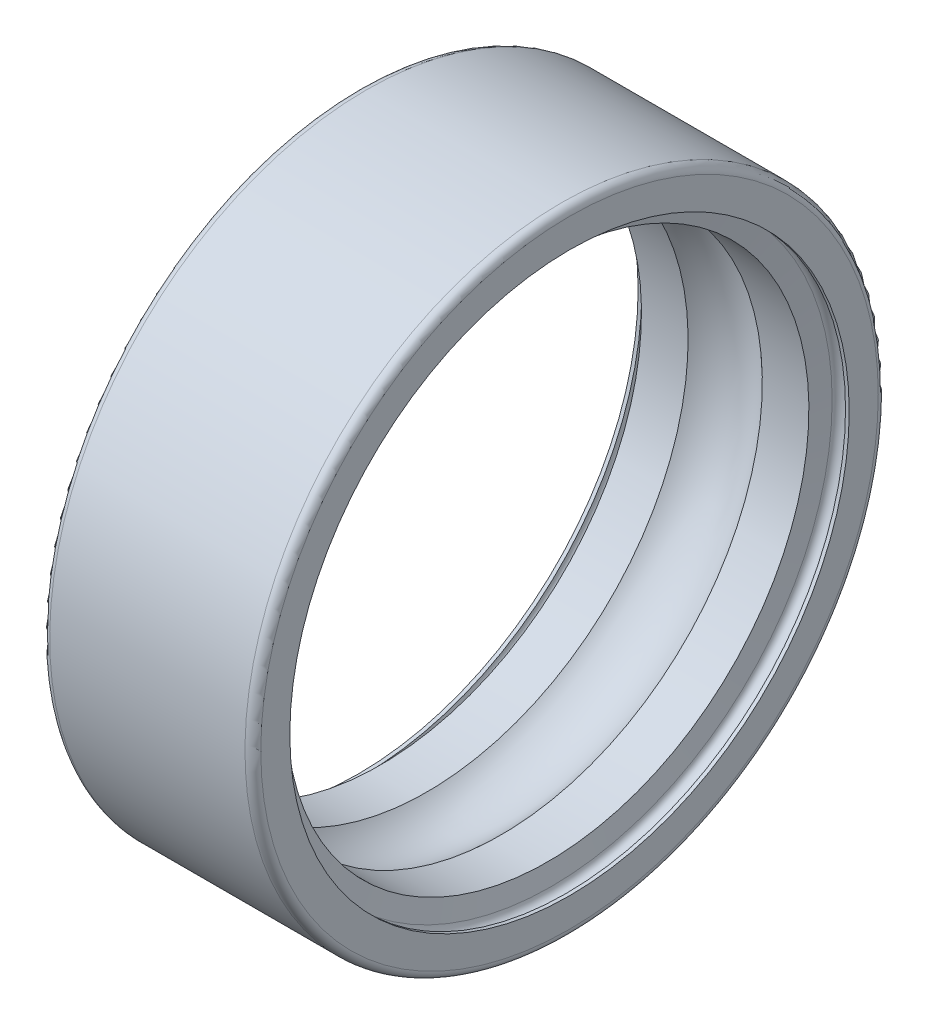
ISO-10303-21;
HEADER;
FILE_DESCRIPTION(('STEP AP214'),'2;1');
FILE_NAME('part.step','',(''),(''),'','','');
FILE_SCHEMA(('AUTOMOTIVE_DESIGN { 1 0 10303 214 1 1 1 1 }'));
ENDSEC;
DATA;
#1=APPLICATION_CONTEXT('core data for automotive mechanical design processes');
#2=APPLICATION_PROTOCOL_DEFINITION('international standard','automotive_design',2000,#1);
#3=PRODUCT_CONTEXT('',#1,'mechanical');
#4=PRODUCT('Part','Part','',(#3));
#5=PRODUCT_RELATED_PRODUCT_CATEGORY('part','',(#4));
#6=PRODUCT_DEFINITION_FORMATION('','',#4);
#7=PRODUCT_DEFINITION_CONTEXT('part definition',#1,'design');
#8=PRODUCT_DEFINITION('design','',#6,#7);
#9=PRODUCT_DEFINITION_SHAPE('','',#8);
#10=(LENGTH_UNIT() NAMED_UNIT(*) SI_UNIT(.MILLI.,.METRE.));
#11=(NAMED_UNIT(*) PLANE_ANGLE_UNIT() SI_UNIT($,.RADIAN.));
#12=(NAMED_UNIT(*) SI_UNIT($,.STERADIAN.) SOLID_ANGLE_UNIT());
#13=UNCERTAINTY_MEASURE_WITH_UNIT(LENGTH_MEASURE(1.E-05),#10,'distance_accuracy_value','');
#14=(GEOMETRIC_REPRESENTATION_CONTEXT(3) GLOBAL_UNCERTAINTY_ASSIGNED_CONTEXT((#13)) GLOBAL_UNIT_ASSIGNED_CONTEXT((#10,
#11,#12)) REPRESENTATION_CONTEXT('',''));
#15=CARTESIAN_POINT('',(0.,0.,0.));
#16=DIRECTION('',(0.,0.,1.));
#17=DIRECTION('',(1.,0.,0.));
#18=AXIS2_PLACEMENT_3D('',#15,#16,#17);
#19=CARTESIAN_POINT('',(7.58,0.,0.));
#20=DIRECTION('',(1.,0.,0.));
#21=DIRECTION('',(0.,0.,-1.));
#22=AXIS2_PLACEMENT_3D('',#19,#20,#21);
#23=TOROIDAL_SURFACE('',#22,10.6,0.28);
#24=CARTESIAN_POINT('',(7.86,0.,0.));
#25=DIRECTION('',(1.,0.,0.));
#26=DIRECTION('',(0.,1.,0.));
#27=AXIS2_PLACEMENT_3D('',#24,#25,#26);
#28=CIRCLE('',#27,10.6);
#29=CARTESIAN_POINT('',(7.86,10.6,0.));
#30=VERTEX_POINT('',#29);
#31=EDGE_CURVE('E11',#30,#30,#28,.T.);
#32=ORIENTED_EDGE('',*,*,#31,.T.);
#33=EDGE_LOOP('',(#32));
#34=FACE_BOUND('',#33,.T.);
#35=CARTESIAN_POINT('',(7.30425382915658,0.,0.));
#36=DIRECTION('',(1.,0.,0.));
#37=DIRECTION('',(0.,1.,0.));
#38=AXIS2_PLACEMENT_3D('',#35,#36,#37);
#39=CIRCLE('',#38,10.6486214897467);
#40=CARTESIAN_POINT('',(7.30425382915658,10.6486214897467,0.));
#41=VERTEX_POINT('',#40);
#42=EDGE_CURVE('E86',#41,#41,#39,.T.);
#43=ORIENTED_EDGE('',*,*,#42,.F.);
#44=EDGE_LOOP('',(#43));
#45=FACE_BOUND('',#44,.T.);
#46=ADVANCED_FACE('F16',(#34,#45),#23,.F.);
#47=CARTESIAN_POINT('',(7.93,0.,0.));
#48=DIRECTION('',(-1.,0.,0.));
#49=DIRECTION('',(0.,1.,0.));
#50=AXIS2_PLACEMENT_3D('',#47,#48,#49);
#51=CYLINDRICAL_SURFACE('',#50,10.6);
#52=CARTESIAN_POINT('',(8.,0.,0.));
#53=DIRECTION('',(1.,0.,0.));
#54=DIRECTION('',(0.,1.,0.));
#55=AXIS2_PLACEMENT_3D('',#52,#53,#54);
#56=CIRCLE('',#55,10.6);
#57=CARTESIAN_POINT('',(8.,10.6,0.));
#58=VERTEX_POINT('',#57);
#59=EDGE_CURVE('E27',#58,#58,#56,.T.);
#60=ORIENTED_EDGE('',*,*,#59,.T.);
#61=EDGE_LOOP('',(#60));
#62=FACE_BOUND('',#61,.T.);
#63=ORIENTED_EDGE('',*,*,#31,.F.);
#64=EDGE_LOOP('',(#63));
#65=FACE_BOUND('',#64,.T.);
#66=ADVANCED_FACE('F131',(#62,#65),#51,.F.);
#67=CARTESIAN_POINT('',(8.,11.15,0.));
#68=DIRECTION('',(1.,0.,0.));
#69=DIRECTION('',(0.,1.,0.));
#70=AXIS2_PLACEMENT_3D('',#67,#68,#69);
#71=PLANE('',#70);
#72=CARTESIAN_POINT('',(8.,0.,0.));
#73=DIRECTION('',(1.,0.,0.));
#74=DIRECTION('',(0.,1.,0.));
#75=AXIS2_PLACEMENT_3D('',#72,#73,#74);
#76=CIRCLE('',#75,11.7);
#77=CARTESIAN_POINT('',(8.,11.7,0.));
#78=VERTEX_POINT('',#77);
#79=EDGE_CURVE('E64',#78,#78,#76,.T.);
#80=ORIENTED_EDGE('',*,*,#79,.T.);
#81=EDGE_LOOP('',(#80));
#82=FACE_BOUND('',#81,.T.);
#83=ORIENTED_EDGE('',*,*,#59,.F.);
#84=EDGE_LOOP('',(#83));
#85=FACE_BOUND('',#84,.T.);
#86=ADVANCED_FACE('F18',(#82,#85),#71,.T.);
#87=CARTESIAN_POINT('',(7.7,0.,0.));
#88=DIRECTION('',(1.,0.,0.));
#89=DIRECTION('',(0.,0.,-1.));
#90=AXIS2_PLACEMENT_3D('',#87,#88,#89);
#91=TOROIDAL_SURFACE('',#90,11.7,0.3);
#92=CARTESIAN_POINT('',(7.7,0.,0.));
#93=DIRECTION('',(1.,0.,0.));
#94=DIRECTION('',(0.,1.,0.));
#95=AXIS2_PLACEMENT_3D('',#92,#93,#94);
#96=CIRCLE('',#95,12.);
#97=CARTESIAN_POINT('',(7.7,12.,0.));
#98=VERTEX_POINT('',#97);
#99=EDGE_CURVE('E68',#98,#98,#96,.T.);
#100=ORIENTED_EDGE('',*,*,#99,.T.);
#101=EDGE_LOOP('',(#100));
#102=FACE_BOUND('',#101,.T.);
#103=ORIENTED_EDGE('',*,*,#79,.F.);
#104=EDGE_LOOP('',(#103));
#105=FACE_BOUND('',#104,.T.);
#106=ADVANCED_FACE('F69',(#102,#105),#91,.T.);
#107=CARTESIAN_POINT('',(4.,0.,0.));
#108=DIRECTION('',(-1.,0.,0.));
#109=DIRECTION('',(0.,1.,0.));
#110=AXIS2_PLACEMENT_3D('',#107,#108,#109);
#111=CYLINDRICAL_SURFACE('',#110,12.);
#112=CARTESIAN_POINT('',(0.3,0.,0.));
#113=DIRECTION('',(1.,0.,0.));
#114=DIRECTION('',(0.,1.,0.));
#115=AXIS2_PLACEMENT_3D('',#112,#113,#114);
#116=CIRCLE('',#115,12.);
#117=CARTESIAN_POINT('',(0.3,12.,0.));
#118=VERTEX_POINT('',#117);
#119=EDGE_CURVE('E73',#118,#118,#116,.T.);
#120=ORIENTED_EDGE('',*,*,#119,.T.);
#121=EDGE_LOOP('',(#120));
#122=FACE_BOUND('',#121,.T.);
#123=ORIENTED_EDGE('',*,*,#99,.F.);
#124=EDGE_LOOP('',(#123));
#125=FACE_BOUND('',#124,.T.);
#126=ADVANCED_FACE('F141',(#122,#125),#111,.T.);
#127=CARTESIAN_POINT('',(0.3,0.,0.));
#128=DIRECTION('',(1.,0.,0.));
#129=DIRECTION('',(0.,0.,-1.));
#130=AXIS2_PLACEMENT_3D('',#127,#128,#129);
#131=TOROIDAL_SURFACE('',#130,11.7,0.3);
#132=CARTESIAN_POINT('',(0.,0.,0.));
#133=DIRECTION('',(1.,0.,0.));
#134=DIRECTION('',(0.,1.,0.));
#135=AXIS2_PLACEMENT_3D('',#132,#133,#134);
#136=CIRCLE('',#135,11.7);
#137=CARTESIAN_POINT('',(0.,11.7,0.));
#138=VERTEX_POINT('',#137);
#139=EDGE_CURVE('E79',#138,#138,#136,.T.);
#140=ORIENTED_EDGE('',*,*,#139,.T.);
#141=EDGE_LOOP('',(#140));
#142=FACE_BOUND('',#141,.T.);
#143=ORIENTED_EDGE('',*,*,#119,.F.);
#144=EDGE_LOOP('',(#143));
#145=FACE_BOUND('',#144,.T.);
#146=ADVANCED_FACE('F126',(#142,#145),#131,.T.);
#147=CARTESIAN_POINT('',(0.,11.15,0.));
#148=DIRECTION('',(-1.,0.,0.));
#149=DIRECTION('',(0.,-1.,0.));
#150=AXIS2_PLACEMENT_3D('',#147,#148,#149);
#151=PLANE('',#150);
#152=CARTESIAN_POINT('',(0.,0.,0.));
#153=DIRECTION('',(1.,0.,0.));
#154=DIRECTION('',(0.,1.,0.));
#155=AXIS2_PLACEMENT_3D('',#152,#153,#154);
#156=CIRCLE('',#155,10.6);
#157=CARTESIAN_POINT('',(0.,10.6,0.));
#158=VERTEX_POINT('',#157);
#159=EDGE_CURVE('E99',#158,#158,#156,.T.);
#160=ORIENTED_EDGE('',*,*,#159,.T.);
#161=EDGE_LOOP('',(#160));
#162=FACE_BOUND('',#161,.T.);
#163=ORIENTED_EDGE('',*,*,#139,.F.);
#164=EDGE_LOOP('',(#163));
#165=FACE_BOUND('',#164,.T.);
#166=ADVANCED_FACE('F110',(#162,#165),#151,.T.);
#167=CARTESIAN_POINT('',(0.07,0.,0.));
#168=DIRECTION('',(-1.,0.,0.));
#169=DIRECTION('',(0.,1.,0.));
#170=AXIS2_PLACEMENT_3D('',#167,#168,#169);
#171=CYLINDRICAL_SURFACE('',#170,10.6);
#172=CARTESIAN_POINT('',(0.14,0.,0.));
#173=DIRECTION('',(1.,0.,0.));
#174=DIRECTION('',(0.,1.,0.));
#175=AXIS2_PLACEMENT_3D('',#172,#173,#174);
#176=CIRCLE('',#175,10.6);
#177=CARTESIAN_POINT('',(0.14,10.6,0.));
#178=VERTEX_POINT('',#177);
#179=EDGE_CURVE('E91',#178,#178,#176,.T.);
#180=ORIENTED_EDGE('',*,*,#179,.T.);
#181=EDGE_LOOP('',(#180));
#182=FACE_BOUND('',#181,.T.);
#183=ORIENTED_EDGE('',*,*,#159,.F.);
#184=EDGE_LOOP('',(#183));
#185=FACE_BOUND('',#184,.T.);
#186=ADVANCED_FACE('F113',(#182,#185),#171,.F.);
#187=CARTESIAN_POINT('',(0.42,0.,0.));
#188=DIRECTION('',(1.,0.,0.));
#189=DIRECTION('',(0.,0.,-1.));
#190=AXIS2_PLACEMENT_3D('',#187,#188,#189);
#191=TOROIDAL_SURFACE('',#190,10.6,0.28);
#192=CARTESIAN_POINT('',(0.695746170843417,0.,0.));
#193=DIRECTION('',(1.,0.,0.));
#194=DIRECTION('',(0.,1.,0.));
#195=AXIS2_PLACEMENT_3D('',#192,#193,#194);
#196=CIRCLE('',#195,10.6486214897467);
#197=CARTESIAN_POINT('',(0.695746170843417,10.6486214897467,0.));
#198=VERTEX_POINT('',#197);
#199=EDGE_CURVE('E87',#198,#198,#196,.T.);
#200=ORIENTED_EDGE('',*,*,#199,.T.);
#201=EDGE_LOOP('',(#200));
#202=FACE_BOUND('',#201,.T.);
#203=ORIENTED_EDGE('',*,*,#179,.F.);
#204=EDGE_LOOP('',(#203));
#205=FACE_BOUND('',#204,.T.);
#206=ADVANCED_FACE('F115',(#202,#205),#191,.F.);
#207=CARTESIAN_POINT('',(0.761747254333675,0.,0.));
#208=DIRECTION('',(-1.,0.,0.));
#209=DIRECTION('',(0.,1.,0.));
#210=AXIS2_PLACEMENT_3D('',#207,#208,#209);
#211=CONICAL_SURFACE('',#210,10.2743107448734,1.39626340159546);
#212=CARTESIAN_POINT('',(0.827748337823933,0.,0.));
#213=DIRECTION('',(1.,0.,0.));
#214=DIRECTION('',(0.,1.,0.));
#215=AXIS2_PLACEMENT_3D('',#212,#213,#214);
#216=CIRCLE('',#215,9.9);
#217=CARTESIAN_POINT('',(0.827748337823933,9.9,0.));
#218=VERTEX_POINT('',#217);
#219=EDGE_CURVE('E20',#218,#218,#216,.T.);
#220=ORIENTED_EDGE('',*,*,#219,.T.);
#221=EDGE_LOOP('',(#220));
#222=FACE_BOUND('',#221,.T.);
#223=ORIENTED_EDGE('',*,*,#199,.F.);
#224=EDGE_LOOP('',(#223));
#225=FACE_BOUND('',#224,.T.);
#226=ADVANCED_FACE('F123',(#222,#225),#211,.F.);
#227=CARTESIAN_POINT('',(1.71062452440442,0.,0.));
#228=DIRECTION('',(-1.,0.,0.));
#229=DIRECTION('',(0.,1.,0.));
#230=AXIS2_PLACEMENT_3D('',#227,#228,#229);
#231=CYLINDRICAL_SURFACE('',#230,9.9);
#232=CARTESIAN_POINT('',(2.5935007109849,0.,0.));
#233=DIRECTION('',(1.,0.,0.));
#234=DIRECTION('',(0.,1.,0.));
#235=AXIS2_PLACEMENT_3D('',#232,#233,#234);
#236=CIRCLE('',#235,9.9);
#237=CARTESIAN_POINT('',(2.5935007109849,9.9,0.));
#238=VERTEX_POINT('',#237);
#239=EDGE_CURVE('E85',#238,#238,#236,.T.);
#240=ORIENTED_EDGE('',*,*,#239,.T.);
#241=EDGE_LOOP('',(#240));
#242=FACE_BOUND('',#241,.T.);
#243=ORIENTED_EDGE('',*,*,#219,.F.);
#244=EDGE_LOOP('',(#243));
#245=FACE_BOUND('',#244,.T.);
#246=ADVANCED_FACE('F242',(#242,#245),#231,.F.);
#247=CARTESIAN_POINT('',(4.,0.,0.));
#248=DIRECTION('',(1.,0.,0.));
#249=DIRECTION('',(0.,0.,-1.));
#250=AXIS2_PLACEMENT_3D('',#247,#248,#249);
#251=TOROIDAL_SURFACE('',#250,8.5,1.9845);
#252=CARTESIAN_POINT('',(5.4064992890151,0.,0.));
#253=DIRECTION('',(1.,0.,0.));
#254=DIRECTION('',(0.,1.,0.));
#255=AXIS2_PLACEMENT_3D('',#252,#253,#254);
#256=CIRCLE('',#255,9.9);
#257=CARTESIAN_POINT('',(5.4064992890151,9.9,0.));
#258=VERTEX_POINT('',#257);
#259=EDGE_CURVE('E82',#258,#258,#256,.T.);
#260=ORIENTED_EDGE('',*,*,#259,.T.);
#261=EDGE_LOOP('',(#260));
#262=FACE_BOUND('',#261,.T.);
#263=ORIENTED_EDGE('',*,*,#239,.F.);
#264=EDGE_LOOP('',(#263));
#265=FACE_BOUND('',#264,.T.);
#266=ADVANCED_FACE('F254',(#262,#265),#251,.F.);
#267=CARTESIAN_POINT('',(6.28937547559559,0.,0.));
#268=DIRECTION('',(-1.,0.,0.));
#269=DIRECTION('',(0.,1.,0.));
#270=AXIS2_PLACEMENT_3D('',#267,#268,#269);
#271=CYLINDRICAL_SURFACE('',#270,9.9);
#272=CARTESIAN_POINT('',(7.17225166217607,0.,0.));
#273=DIRECTION('',(1.,0.,0.));
#274=DIRECTION('',(0.,1.,0.));
#275=AXIS2_PLACEMENT_3D('',#272,#273,#274);
#276=CIRCLE('',#275,9.9);
#277=CARTESIAN_POINT('',(7.17225166217607,9.9,0.));
#278=VERTEX_POINT('',#277);
#279=EDGE_CURVE('E92',#278,#278,#276,.T.);
#280=ORIENTED_EDGE('',*,*,#279,.T.);
#281=EDGE_LOOP('',(#280));
#282=FACE_BOUND('',#281,.T.);
#283=ORIENTED_EDGE('',*,*,#259,.F.);
#284=EDGE_LOOP('',(#283));
#285=FACE_BOUND('',#284,.T.);
#286=ADVANCED_FACE('F266',(#282,#285),#271,.F.);
#287=CARTESIAN_POINT('',(7.23825274566632,0.,0.));
#288=DIRECTION('',(1.,0.,0.));
#289=DIRECTION('',(0.,1.,0.));
#290=AXIS2_PLACEMENT_3D('',#287,#288,#289);
#291=CONICAL_SURFACE('',#290,10.2743107448734,1.39626340159546);
#292=ORIENTED_EDGE('',*,*,#42,.T.);
#293=EDGE_LOOP('',(#292));
#294=FACE_BOUND('',#293,.T.);
#295=ORIENTED_EDGE('',*,*,#279,.F.);
#296=EDGE_LOOP('',(#295));
#297=FACE_BOUND('',#296,.T.);
#298=ADVANCED_FACE('F139',(#294,#297),#291,.F.);
#299=CLOSED_SHELL('',(#46,#66,#86,#106,#126,#146,#166,#186,#206,#226,#246,#266,#286,#298));
#300=MANIFOLD_SOLID_BREP('B1',#299);
#301=ADVANCED_BREP_SHAPE_REPRESENTATION('',(#18,#300),#14);
#302=SHAPE_DEFINITION_REPRESENTATION(#9,#301);
ENDSEC;
END-ISO-10303-21;
